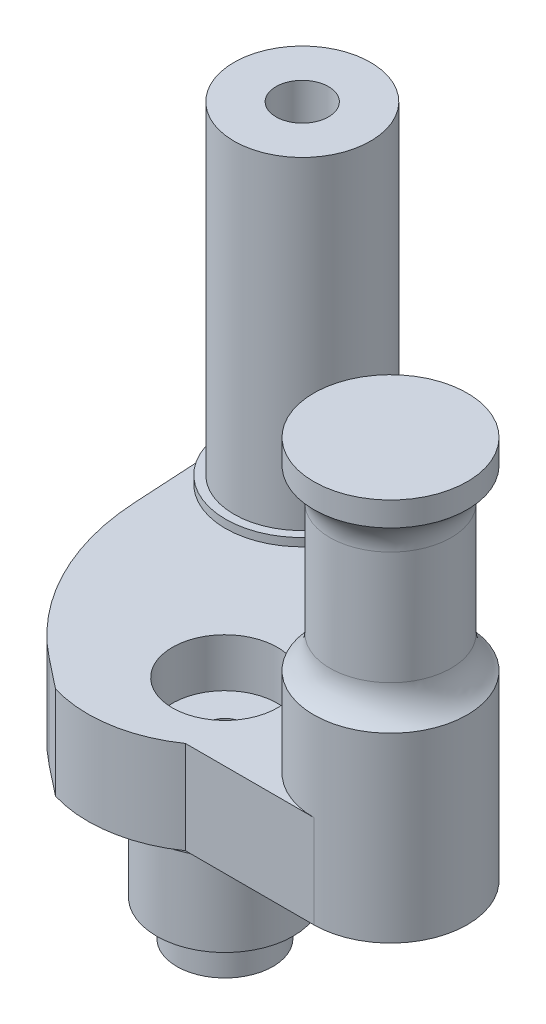
ISO-10303-21;
HEADER;
FILE_DESCRIPTION(('STEP AP214'),'2;1');
FILE_NAME('part.step','',(''),(''),'','','');
FILE_SCHEMA(('AUTOMOTIVE_DESIGN { 1 0 10303 214 1 1 1 1 }'));
ENDSEC;
DATA;
#1=APPLICATION_CONTEXT('core data for automotive mechanical design processes');
#2=APPLICATION_PROTOCOL_DEFINITION('international standard','automotive_design',2000,#1);
#3=PRODUCT_CONTEXT('',#1,'mechanical');
#4=PRODUCT('Part','Part','',(#3));
#5=PRODUCT_RELATED_PRODUCT_CATEGORY('part','',(#4));
#6=PRODUCT_DEFINITION_FORMATION('','',#4);
#7=PRODUCT_DEFINITION_CONTEXT('part definition',#1,'design');
#8=PRODUCT_DEFINITION('design','',#6,#7);
#9=PRODUCT_DEFINITION_SHAPE('','',#8);
#10=(LENGTH_UNIT() NAMED_UNIT(*) SI_UNIT(.MILLI.,.METRE.));
#11=(NAMED_UNIT(*) PLANE_ANGLE_UNIT() SI_UNIT($,.RADIAN.));
#12=(NAMED_UNIT(*) SI_UNIT($,.STERADIAN.) SOLID_ANGLE_UNIT());
#13=UNCERTAINTY_MEASURE_WITH_UNIT(LENGTH_MEASURE(1.E-05),#10,'distance_accuracy_value','');
#14=(GEOMETRIC_REPRESENTATION_CONTEXT(3) GLOBAL_UNCERTAINTY_ASSIGNED_CONTEXT((#13)) GLOBAL_UNIT_ASSIGNED_CONTEXT((#10,
#11,#12)) REPRESENTATION_CONTEXT('',''));
#15=CARTESIAN_POINT('',(0.,0.,0.));
#16=DIRECTION('',(0.,0.,1.));
#17=DIRECTION('',(1.,0.,0.));
#18=AXIS2_PLACEMENT_3D('',#15,#16,#17);
#19=CARTESIAN_POINT('',(20.5,64.,0.));
#20=DIRECTION('',(0.,-1.,0.));
#21=DIRECTION('',(0.,0.,-1.));
#22=AXIS2_PLACEMENT_3D('',#19,#20,#21);
#23=CYLINDRICAL_SURFACE('',#22,9.5);
#24=CARTESIAN_POINT('',(20.5,16.5,0.));
#25=DIRECTION('',(0.,1.,0.));
#26=DIRECTION('',(0.,0.,1.));
#27=AXIS2_PLACEMENT_3D('',#24,#25,#26);
#28=CIRCLE('',#27,9.5);
#29=CARTESIAN_POINT('',(20.5,16.5,-9.5));
#30=VERTEX_POINT('',#29);
#31=CARTESIAN_POINT('',(20.5,16.5,9.5));
#32=VERTEX_POINT('',#31);
#33=EDGE_CURVE('E168',#30,#32,#28,.F.);
#34=ORIENTED_EDGE('',*,*,#33,.F.);
#35=DIRECTION('',(0.,1.,0.));
#36=VECTOR('',#35,1.);
#37=CARTESIAN_POINT('',(20.5,9.99999999999999,-9.5));
#38=LINE('',#37,#36);
#39=CARTESIAN_POINT('',(20.5,28.,-9.5));
#40=VERTEX_POINT('',#39);
#41=EDGE_CURVE('E171',#30,#40,#38,.T.);
#42=ORIENTED_EDGE('',*,*,#41,.T.);
#43=CARTESIAN_POINT('',(20.5,28.,0.));
#44=DIRECTION('',(0.,1.,0.));
#45=DIRECTION('',(0.,0.,1.));
#46=AXIS2_PLACEMENT_3D('',#43,#44,#45);
#47=CIRCLE('',#46,9.5);
#48=CARTESIAN_POINT('',(20.5,28.,9.5));
#49=VERTEX_POINT('',#48);
#50=EDGE_CURVE('E201',#49,#40,#47,.F.);
#51=ORIENTED_EDGE('',*,*,#50,.F.);
#52=DIRECTION('',(0.,1.,0.));
#53=VECTOR('',#52,1.);
#54=CARTESIAN_POINT('',(20.5,9.99999999999999,9.5));
#55=LINE('',#54,#53);
#56=EDGE_CURVE('E174',#32,#49,#55,.T.);
#57=ORIENTED_EDGE('',*,*,#56,.F.);
#58=EDGE_LOOP('',(#34,#42,#51,#57));
#59=FACE_BOUND('',#58,.T.);
#60=CARTESIAN_POINT('',(20.5,39.,0.));
#61=DIRECTION('',(0.,1.,0.));
#62=DIRECTION('',(0.,0.,1.));
#63=AXIS2_PLACEMENT_3D('',#60,#61,#62);
#64=CIRCLE('',#63,9.5);
#65=CARTESIAN_POINT('',(20.5,39.,9.5));
#66=VERTEX_POINT('',#65);
#67=EDGE_CURVE('E164',#66,#66,#64,.T.);
#68=ORIENTED_EDGE('',*,*,#67,.F.);
#69=EDGE_LOOP('',(#68));
#70=FACE_BOUND('',#69,.T.);
#71=ADVANCED_FACE('F33',(#59,#70),#23,.T.);
#72=CARTESIAN_POINT('',(-0.833655922108794,28.,-0.499999999999999));
#73=DIRECTION('',(0.,1.,0.));
#74=DIRECTION('',(0.,0.,1.));
#75=AXIS2_PLACEMENT_3D('',#72,#73,#74);
#76=PLANE('',#75);
#77=DIRECTION('',(-1.,0.,0.));
#78=VECTOR('',#77,1.);
#79=CARTESIAN_POINT('',(7.00207538209712,28.,-9.5));
#80=LINE('',#79,#78);
#81=CARTESIAN_POINT('',(10.4713346025976,28.,-9.5));
#82=VERTEX_POINT('',#81);
#83=EDGE_CURVE('E124',#40,#82,#80,.T.);
#84=ORIENTED_EDGE('',*,*,#83,.T.);
#85=CARTESIAN_POINT('',(-4.59066256217014,28.,-3.73892504377688));
#86=DIRECTION('',(0.,1.,0.));
#87=DIRECTION('',(0.,0.,1.));
#88=AXIS2_PLACEMENT_3D('',#85,#86,#87);
#89=CIRCLE('',#88,16.1261819176981);
#90=CARTESIAN_POINT('',(9.37187276386313,28.,-11.8074658357643));
#91=VERTEX_POINT('',#90);
#92=EDGE_CURVE('E118',#82,#91,#89,.T.);
#93=ORIENTED_EDGE('',*,*,#92,.T.);
#94=DIRECTION('',(-0.784978393682853,0.,-0.619523140367724));
#95=VECTOR('',#94,1.);
#96=CARTESIAN_POINT('',(9.37187276386313,28.,-11.8074658357643));
#97=LINE('',#96,#95);
#98=CARTESIAN_POINT('',(-4.95541630779931,28.,-23.1148944096756));
#99=VERTEX_POINT('',#98);
#100=EDGE_CURVE('E123',#91,#99,#97,.T.);
#101=ORIENTED_EDGE('',*,*,#100,.T.);
#102=DIRECTION('',(-0.342020143325673,0.,-0.939692620785907));
#103=VECTOR('',#102,1.);
#104=CARTESIAN_POINT('',(-2.39485082576202,28.,-16.0797985667433));
#105=LINE('',#104,#103);
#106=CARTESIAN_POINT('',(-7.01141293817628,28.,-28.7636987261111));
#107=VERTEX_POINT('',#106);
#108=EDGE_CURVE('E48',#99,#107,#105,.T.);
#109=ORIENTED_EDGE('',*,*,#108,.T.);
#110=CARTESIAN_POINT('',(-15.9384928356424,28.,-25.5145073645172));
#111=DIRECTION('',(0.,1.,0.));
#112=DIRECTION('',(0.,0.,1.));
#113=AXIS2_PLACEMENT_3D('',#110,#111,#112);
#114=CIRCLE('',#113,9.50000000000001);
#115=CARTESIAN_POINT('',(-24.8655727331085,28.,-22.2653160029233));
#116=VERTEX_POINT('',#115);
#117=EDGE_CURVE('E218',#116,#107,#114,.T.);
#118=ORIENTED_EDGE('',*,*,#117,.F.);
#119=DIRECTION('',(0.0572306718588479,0.,0.998360981909141));
#120=VECTOR('',#119,1.);
#121=CARTESIAN_POINT('',(-24.3377118734043,28.,-13.0570423781535));
#122=LINE('',#121,#120);
#123=CARTESIAN_POINT('',(-24.3377118734043,28.,-13.0570423781535));
#124=VERTEX_POINT('',#123);
#125=EDGE_CURVE('E141',#116,#124,#122,.T.);
#126=ORIENTED_EDGE('',*,*,#125,.T.);
#127=CARTESIAN_POINT('',(5.61311758386992,28.,-14.7739625339188));
#128=DIRECTION('',(0.,1.,0.));
#129=DIRECTION('',(0.,0.,-1.));
#130=AXIS2_PLACEMENT_3D('',#127,#128,#129);
#131=CIRCLE('',#130,30.);
#132=CARTESIAN_POINT('',(-12.9725766271618,28.,8.77538927656681));
#133=VERTEX_POINT('',#132);
#134=EDGE_CURVE('E144',#124,#133,#131,.T.);
#135=ORIENTED_EDGE('',*,*,#134,.T.);
#136=DIRECTION('',(0.784978393682853,0.,0.619523140367725));
#137=VECTOR('',#136,1.);
#138=CARTESIAN_POINT('',(-9.27848203552042,28.,11.6908543398686));
#139=LINE('',#138,#137);
#140=CARTESIAN_POINT('',(-9.27848203552042,28.,11.6908543398686));
#141=VERTEX_POINT('',#140);
#142=EDGE_CURVE('E137',#133,#141,#139,.T.);
#143=ORIENTED_EDGE('',*,*,#142,.T.);
#144=CARTESIAN_POINT('',(4.61719315607121,28.,9.5));
#145=VERTEX_POINT('',#144);
#146=EDGE_CURVE('E126',#141,#145,#89,.T.);
#147=ORIENTED_EDGE('',*,*,#146,.T.);
#148=DIRECTION('',(1.,0.,0.));
#149=VECTOR('',#148,1.);
#150=CARTESIAN_POINT('',(30.,28.,9.5));
#151=LINE('',#150,#149);
#152=EDGE_CURVE('E217',#145,#49,#151,.T.);
#153=ORIENTED_EDGE('',*,*,#152,.T.);
#154=ORIENTED_EDGE('',*,*,#50,.T.);
#155=EDGE_LOOP('',(#84,#93,#101,#109,#118,#126,#135,#143,#147,#153,#154));
#156=FACE_BOUND('',#155,.T.);
#157=CARTESIAN_POINT('',(0.,28.,0.));
#158=DIRECTION('',(0.,1.,0.));
#159=DIRECTION('',(0.,0.,1.));
#160=AXIS2_PLACEMENT_3D('',#157,#158,#159);
#161=CIRCLE('',#160,6.5);
#162=CARTESIAN_POINT('',(0.,28.,6.5));
#163=VERTEX_POINT('',#162);
#164=EDGE_CURVE('E204',#163,#163,#161,.T.);
#165=ORIENTED_EDGE('',*,*,#164,.F.);
#166=EDGE_LOOP('',(#165));
#167=FACE_BOUND('',#166,.T.);
#168=ADVANCED_FACE('F120',(#156,#167),#76,.T.);
#169=CARTESIAN_POINT('',(0.,29.,0.));
#170=DIRECTION('',(0.,-1.,0.));
#171=DIRECTION('',(0.,0.,-1.));
#172=AXIS2_PLACEMENT_3D('',#169,#170,#171);
#173=CYLINDRICAL_SURFACE('',#172,2.3);
#174=CARTESIAN_POINT('',(0.,0.,0.));
#175=DIRECTION('',(0.,-1.,0.));
#176=DIRECTION('',(0.,0.,-1.));
#177=AXIS2_PLACEMENT_3D('',#174,#175,#176);
#178=CIRCLE('',#177,2.3);
#179=CARTESIAN_POINT('',(0.,0.,-2.3));
#180=VERTEX_POINT('',#179);
#181=EDGE_CURVE('E211',#180,#180,#178,.T.);
#182=ORIENTED_EDGE('',*,*,#181,.T.);
#183=EDGE_LOOP('',(#182));
#184=FACE_BOUND('',#183,.T.);
#185=CARTESIAN_POINT('',(0.,22.,0.));
#186=DIRECTION('',(0.,1.,0.));
#187=DIRECTION('',(0.,0.,1.));
#188=AXIS2_PLACEMENT_3D('',#185,#186,#187);
#189=CIRCLE('',#188,2.3);
#190=CARTESIAN_POINT('',(0.,22.,2.3));
#191=VERTEX_POINT('',#190);
#192=EDGE_CURVE('E208',#191,#191,#189,.F.);
#193=ORIENTED_EDGE('',*,*,#192,.F.);
#194=EDGE_LOOP('',(#193));
#195=FACE_BOUND('',#194,.T.);
#196=ADVANCED_FACE('F280',(#184,#195),#173,.F.);
#197=CARTESIAN_POINT('',(0.,22.25,0.));
#198=DIRECTION('',(0.,-1.,0.));
#199=DIRECTION('',(0.,0.,-1.));
#200=AXIS2_PLACEMENT_3D('',#197,#198,#199);
#201=CYLINDRICAL_SURFACE('',#200,8.45);
#202=CARTESIAN_POINT('',(0.,15.5,0.));
#203=DIRECTION('',(0.,-1.,0.));
#204=DIRECTION('',(0.,0.,-1.));
#205=AXIS2_PLACEMENT_3D('',#202,#203,#204);
#206=CIRCLE('',#205,8.45);
#207=CARTESIAN_POINT('',(0.,15.5,-8.45));
#208=VERTEX_POINT('',#207);
#209=EDGE_CURVE('E190',#208,#208,#206,.T.);
#210=ORIENTED_EDGE('',*,*,#209,.T.);
#211=EDGE_LOOP('',(#210));
#212=FACE_BOUND('',#211,.T.);
#213=CARTESIAN_POINT('',(0.,4.5,0.));
#214=DIRECTION('',(0.,1.,0.));
#215=DIRECTION('',(0.,0.,1.));
#216=AXIS2_PLACEMENT_3D('',#213,#214,#215);
#217=CIRCLE('',#216,8.45);
#218=CARTESIAN_POINT('',(0.,4.5,8.45));
#219=VERTEX_POINT('',#218);
#220=EDGE_CURVE('E230',#219,#219,#217,.T.);
#221=ORIENTED_EDGE('',*,*,#220,.T.);
#222=EDGE_LOOP('',(#221));
#223=FACE_BOUND('',#222,.T.);
#224=ADVANCED_FACE('F296',(#212,#223),#201,.T.);
#225=CARTESIAN_POINT('',(0.,4.5,0.));
#226=DIRECTION('',(0.,-1.,0.));
#227=DIRECTION('',(0.,0.,-1.));
#228=AXIS2_PLACEMENT_3D('',#225,#226,#227);
#229=CYLINDRICAL_SURFACE('',#228,5.95);
#230=CARTESIAN_POINT('',(0.,4.5,0.));
#231=DIRECTION('',(0.,1.,0.));
#232=DIRECTION('',(0.,0.,1.));
#233=AXIS2_PLACEMENT_3D('',#230,#231,#232);
#234=CIRCLE('',#233,5.95);
#235=CARTESIAN_POINT('',(0.,4.5,5.95));
#236=VERTEX_POINT('',#235);
#237=EDGE_CURVE('E220',#236,#236,#234,.T.);
#238=ORIENTED_EDGE('',*,*,#237,.F.);
#239=EDGE_LOOP('',(#238));
#240=FACE_BOUND('',#239,.T.);
#241=CARTESIAN_POINT('',(0.,0.,0.));
#242=DIRECTION('',(0.,1.,0.));
#243=DIRECTION('',(0.,0.,1.));
#244=AXIS2_PLACEMENT_3D('',#241,#242,#243);
#245=CIRCLE('',#244,5.95);
#246=CARTESIAN_POINT('',(0.,0.,5.95));
#247=VERTEX_POINT('',#246);
#248=EDGE_CURVE('E233',#247,#247,#245,.T.);
#249=ORIENTED_EDGE('',*,*,#248,.T.);
#250=EDGE_LOOP('',(#249));
#251=FACE_BOUND('',#250,.T.);
#252=ADVANCED_FACE('F326',(#240,#251),#229,.T.);
#253=CARTESIAN_POINT('',(0.,0.,0.));
#254=DIRECTION('',(0.,1.,0.));
#255=DIRECTION('',(0.,0.,1.));
#256=AXIS2_PLACEMENT_3D('',#253,#254,#255);
#257=PLANE('',#256);
#258=ORIENTED_EDGE('',*,*,#181,.F.);
#259=EDGE_LOOP('',(#258));
#260=FACE_BOUND('',#259,.T.);
#261=ORIENTED_EDGE('',*,*,#248,.F.);
#262=EDGE_LOOP('',(#261));
#263=FACE_BOUND('',#262,.T.);
#264=ADVANCED_FACE('F322',(#260,#263),#257,.F.);
#265=CARTESIAN_POINT('',(0.,4.5,0.));
#266=DIRECTION('',(0.,1.,0.));
#267=DIRECTION('',(0.,0.,1.));
#268=AXIS2_PLACEMENT_3D('',#265,#266,#267);
#269=PLANE('',#268);
#270=ORIENTED_EDGE('',*,*,#237,.T.);
#271=EDGE_LOOP('',(#270));
#272=FACE_BOUND('',#271,.T.);
#273=ORIENTED_EDGE('',*,*,#220,.F.);
#274=EDGE_LOOP('',(#273));
#275=FACE_BOUND('',#274,.T.);
#276=ADVANCED_FACE('F314',(#272,#275),#269,.F.);
#277=CARTESIAN_POINT('',(0.,16.5,9.5));
#278=DIRECTION('',(0.,0.,1.));
#279=DIRECTION('',(1.,0.,0.));
#280=AXIS2_PLACEMENT_3D('',#277,#278,#279);
#281=PLANE('',#280);
#282=DIRECTION('',(0.,1.,0.));
#283=VECTOR('',#282,1.);
#284=CARTESIAN_POINT('',(4.61719315607121,-34.6003432232158,9.5));
#285=LINE('',#284,#283);
#286=CARTESIAN_POINT('',(4.61719315607121,16.5,9.5));
#287=VERTEX_POINT('',#286);
#288=EDGE_CURVE('E160',#287,#145,#285,.T.);
#289=ORIENTED_EDGE('',*,*,#288,.F.);
#290=DIRECTION('',(1.,0.,0.));
#291=VECTOR('',#290,1.);
#292=CARTESIAN_POINT('',(30.,16.5,9.5));
#293=LINE('',#292,#291);
#294=EDGE_CURVE('E224',#287,#32,#293,.T.);
#295=ORIENTED_EDGE('',*,*,#294,.T.);
#296=ORIENTED_EDGE('',*,*,#56,.T.);
#297=ORIENTED_EDGE('',*,*,#152,.F.);
#298=EDGE_LOOP('',(#289,#295,#296,#297));
#299=FACE_BOUND('',#298,.T.);
#300=ADVANCED_FACE('F310',(#299),#281,.T.);
#301=CARTESIAN_POINT('',(-2.39485082576202,16.5,-16.0797985667433));
#302=DIRECTION('',(0.939692620785907,0.,-0.342020143325673));
#303=DIRECTION('',(-0.342020143325673,0.,-0.939692620785907));
#304=AXIS2_PLACEMENT_3D('',#301,#302,#303);
#305=PLANE('',#304);
#306=DIRECTION('',(0.,1.,0.));
#307=VECTOR('',#306,1.);
#308=CARTESIAN_POINT('',(-4.95541630779932,16.5,-23.1148944096757));
#309=LINE('',#308,#307);
#310=CARTESIAN_POINT('',(-4.95541630779932,16.5,-23.1148944096757));
#311=VERTEX_POINT('',#310);
#312=EDGE_CURVE('E140',#311,#99,#309,.T.);
#313=ORIENTED_EDGE('',*,*,#312,.F.);
#314=DIRECTION('',(-0.342020143325673,0.,-0.939692620785907));
#315=VECTOR('',#314,1.);
#316=CARTESIAN_POINT('',(-2.39485082576202,16.5,-16.0797985667433));
#317=LINE('',#316,#315);
#318=CARTESIAN_POINT('',(-7.01141293817628,16.5,-28.7636987261111));
#319=VERTEX_POINT('',#318);
#320=EDGE_CURVE('E228',#311,#319,#317,.T.);
#321=ORIENTED_EDGE('',*,*,#320,.T.);
#322=DIRECTION('',(0.,1.,0.));
#323=VECTOR('',#322,1.);
#324=CARTESIAN_POINT('',(-7.01141293817628,9.99999999999999,-28.7636987261111));
#325=LINE('',#324,#323);
#326=EDGE_CURVE('E169',#319,#107,#325,.T.);
#327=ORIENTED_EDGE('',*,*,#326,.T.);
#328=ORIENTED_EDGE('',*,*,#108,.F.);
#329=EDGE_LOOP('',(#313,#321,#327,#328));
#330=FACE_BOUND('',#329,.T.);
#331=ADVANCED_FACE('F313',(#330),#305,.T.);
#332=CARTESIAN_POINT('',(7.00207538209712,16.5,-9.5));
#333=DIRECTION('',(0.,0.,-1.));
#334=DIRECTION('',(-1.,0.,0.));
#335=AXIS2_PLACEMENT_3D('',#332,#333,#334);
#336=PLANE('',#335);
#337=DIRECTION('',(0.,1.,0.));
#338=VECTOR('',#337,1.);
#339=CARTESIAN_POINT('',(10.4713346025976,-34.6003432232158,-9.5));
#340=LINE('',#339,#338);
#341=CARTESIAN_POINT('',(10.4713346025976,16.5,-9.5));
#342=VERTEX_POINT('',#341);
#343=EDGE_CURVE('E56',#82,#342,#340,.F.);
#344=ORIENTED_EDGE('',*,*,#343,.F.);
#345=ORIENTED_EDGE('',*,*,#83,.F.);
#346=ORIENTED_EDGE('',*,*,#41,.F.);
#347=DIRECTION('',(-1.,0.,0.));
#348=VECTOR('',#347,1.);
#349=CARTESIAN_POINT('',(7.00207538209712,16.5,-9.5));
#350=LINE('',#349,#348);
#351=EDGE_CURVE('E226',#30,#342,#350,.T.);
#352=ORIENTED_EDGE('',*,*,#351,.T.);
#353=EDGE_LOOP('',(#344,#345,#346,#352));
#354=FACE_BOUND('',#353,.T.);
#355=ADVANCED_FACE('F308',(#354),#336,.T.);
#356=CARTESIAN_POINT('',(-0.833655922108794,16.5,-0.499999999999999));
#357=DIRECTION('',(0.,1.,0.));
#358=DIRECTION('',(0.,0.,1.));
#359=AXIS2_PLACEMENT_3D('',#356,#357,#358);
#360=PLANE('',#359);
#361=ORIENTED_EDGE('',*,*,#294,.F.);
#362=CARTESIAN_POINT('',(-4.59066256217014,16.5,-3.73892504377688));
#363=DIRECTION('',(0.,1.,0.));
#364=DIRECTION('',(0.,0.,1.));
#365=AXIS2_PLACEMENT_3D('',#362,#363,#364);
#366=CIRCLE('',#365,16.1261819176981);
#367=CARTESIAN_POINT('',(-9.27848203552042,16.5,11.6908543398686));
#368=VERTEX_POINT('',#367);
#369=EDGE_CURVE('E603',#287,#368,#366,.F.);
#370=ORIENTED_EDGE('',*,*,#369,.T.);
#371=DIRECTION('',(-0.784978393682853,0.,-0.619523140367725));
#372=VECTOR('',#371,1.);
#373=CARTESIAN_POINT('',(-9.27848203552042,16.5,11.6908543398686));
#374=LINE('',#373,#372);
#375=CARTESIAN_POINT('',(-12.9725766271618,16.5,8.77538927656682));
#376=VERTEX_POINT('',#375);
#377=EDGE_CURVE('E608',#368,#376,#374,.T.);
#378=ORIENTED_EDGE('',*,*,#377,.T.);
#379=CARTESIAN_POINT('',(5.61311758386992,16.5,-14.7739625339188));
#380=DIRECTION('',(0.,1.,0.));
#381=DIRECTION('',(0.,0.,1.));
#382=AXIS2_PLACEMENT_3D('',#379,#380,#381);
#383=CIRCLE('',#382,30.);
#384=CARTESIAN_POINT('',(-24.3377118734043,16.5,-13.0570423781535));
#385=VERTEX_POINT('',#384);
#386=EDGE_CURVE('E618',#376,#385,#383,.F.);
#387=ORIENTED_EDGE('',*,*,#386,.T.);
#388=DIRECTION('',(-0.0572306718588479,0.,-0.998360981909141));
#389=VECTOR('',#388,1.);
#390=CARTESIAN_POINT('',(-24.3377118734043,16.5,-13.0570423781535));
#391=LINE('',#390,#389);
#392=CARTESIAN_POINT('',(-24.8655727331085,16.5,-22.2653160029233));
#393=VERTEX_POINT('',#392);
#394=EDGE_CURVE('E155',#385,#393,#391,.T.);
#395=ORIENTED_EDGE('',*,*,#394,.T.);
#396=CARTESIAN_POINT('',(-15.9384928356424,16.5,-25.5145073645172));
#397=DIRECTION('',(0.,1.,0.));
#398=DIRECTION('',(0.,0.,1.));
#399=AXIS2_PLACEMENT_3D('',#396,#397,#398);
#400=CIRCLE('',#399,9.50000000000001);
#401=EDGE_CURVE('E200',#393,#319,#400,.F.);
#402=ORIENTED_EDGE('',*,*,#401,.T.);
#403=ORIENTED_EDGE('',*,*,#320,.F.);
#404=DIRECTION('',(0.784978393682854,0.,0.619523140367724));
#405=VECTOR('',#404,1.);
#406=CARTESIAN_POINT('',(9.37187276386313,16.5,-11.8074658357643));
#407=LINE('',#406,#405);
#408=CARTESIAN_POINT('',(9.37187276386313,16.5,-11.8074658357643));
#409=VERTEX_POINT('',#408);
#410=EDGE_CURVE('E161',#311,#409,#407,.T.);
#411=ORIENTED_EDGE('',*,*,#410,.T.);
#412=EDGE_CURVE('E133',#409,#342,#366,.F.);
#413=ORIENTED_EDGE('',*,*,#412,.T.);
#414=ORIENTED_EDGE('',*,*,#351,.F.);
#415=ORIENTED_EDGE('',*,*,#33,.T.);
#416=EDGE_LOOP('',(#361,#370,#378,#387,#395,#402,#403,#411,#413,#414,#415));
#417=FACE_BOUND('',#416,.T.);
#418=CARTESIAN_POINT('',(0.,16.5,0.));
#419=DIRECTION('',(0.,-1.,0.));
#420=DIRECTION('',(0.,0.,-1.));
#421=AXIS2_PLACEMENT_3D('',#418,#419,#420);
#422=CIRCLE('',#421,9.5);
#423=CARTESIAN_POINT('',(0.,16.5,-9.5));
#424=VERTEX_POINT('',#423);
#425=EDGE_CURVE('E184',#424,#424,#422,.T.);
#426=ORIENTED_EDGE('',*,*,#425,.F.);
#427=EDGE_LOOP('',(#426));
#428=FACE_BOUND('',#427,.T.);
#429=ADVANCED_FACE('F303',(#417,#428),#360,.F.);
#430=CARTESIAN_POINT('',(-15.9384928356424,29.,-25.5145073645172));
#431=DIRECTION('',(0.,-1.,0.));
#432=DIRECTION('',(0.,0.,-1.));
#433=AXIS2_PLACEMENT_3D('',#430,#431,#432);
#434=CYLINDRICAL_SURFACE('',#433,9.50000000000001);
#435=ORIENTED_EDGE('',*,*,#401,.F.);
#436=DIRECTION('',(0.,1.,0.));
#437=VECTOR('',#436,1.);
#438=CARTESIAN_POINT('',(-24.8655727331085,9.99999999999999,-22.2653160029233));
#439=LINE('',#438,#437);
#440=EDGE_CURVE('E165',#393,#116,#439,.T.);
#441=ORIENTED_EDGE('',*,*,#440,.T.);
#442=ORIENTED_EDGE('',*,*,#117,.T.);
#443=ORIENTED_EDGE('',*,*,#326,.F.);
#444=EDGE_LOOP('',(#435,#441,#442,#443));
#445=FACE_BOUND('',#444,.T.);
#446=CARTESIAN_POINT('',(-15.9384928356424,29.,-25.5145073645172));
#447=DIRECTION('',(0.,1.,0.));
#448=DIRECTION('',(0.,0.,1.));
#449=AXIS2_PLACEMENT_3D('',#446,#447,#448);
#450=CIRCLE('',#449,9.50000000000001);
#451=CARTESIAN_POINT('',(-15.9384928356424,29.,-16.0145073645172));
#452=VERTEX_POINT('',#451);
#453=EDGE_CURVE('E214',#452,#452,#450,.T.);
#454=ORIENTED_EDGE('',*,*,#453,.F.);
#455=EDGE_LOOP('',(#454));
#456=FACE_BOUND('',#455,.T.);
#457=ADVANCED_FACE('F300',(#445,#456),#434,.T.);
#458=CARTESIAN_POINT('',(-15.9384928356424,29.,-25.5145073645172));
#459=DIRECTION('',(0.,1.,0.));
#460=DIRECTION('',(0.,0.,1.));
#461=AXIS2_PLACEMENT_3D('',#458,#459,#460);
#462=PLANE('',#461);
#463=CARTESIAN_POINT('',(-15.9384928356424,29.,-25.5145073645172));
#464=DIRECTION('',(0.,1.,0.));
#465=DIRECTION('',(0.,0.,1.));
#466=AXIS2_PLACEMENT_3D('',#463,#464,#465);
#467=CIRCLE('',#466,8.45);
#468=CARTESIAN_POINT('',(-15.9384928356424,29.,-17.0645073645172));
#469=VERTEX_POINT('',#468);
#470=EDGE_CURVE('E197',#469,#469,#467,.T.);
#471=ORIENTED_EDGE('',*,*,#470,.F.);
#472=EDGE_LOOP('',(#471));
#473=FACE_BOUND('',#472,.T.);
#474=ORIENTED_EDGE('',*,*,#453,.T.);
#475=EDGE_LOOP('',(#474));
#476=FACE_BOUND('',#475,.T.);
#477=ADVANCED_FACE('F288',(#473,#476),#462,.T.);
#478=CARTESIAN_POINT('',(0.,22.,0.));
#479=DIRECTION('',(0.,1.,0.));
#480=DIRECTION('',(0.,0.,1.));
#481=AXIS2_PLACEMENT_3D('',#478,#479,#480);
#482=PLANE('',#481);
#483=CARTESIAN_POINT('',(0.,22.,0.));
#484=DIRECTION('',(0.,1.,0.));
#485=DIRECTION('',(0.,0.,1.));
#486=AXIS2_PLACEMENT_3D('',#483,#484,#485);
#487=CIRCLE('',#486,6.5);
#488=CARTESIAN_POINT('',(0.,22.,6.5));
#489=VERTEX_POINT('',#488);
#490=EDGE_CURVE('E205',#489,#489,#487,.T.);
#491=ORIENTED_EDGE('',*,*,#490,.T.);
#492=EDGE_LOOP('',(#491));
#493=FACE_BOUND('',#492,.T.);
#494=ORIENTED_EDGE('',*,*,#192,.T.);
#495=EDGE_LOOP('',(#494));
#496=FACE_BOUND('',#495,.T.);
#497=ADVANCED_FACE('F284',(#493,#496),#482,.T.);
#498=CARTESIAN_POINT('',(0.,22.,0.));
#499=DIRECTION('',(0.,1.,0.));
#500=DIRECTION('',(0.,0.,1.));
#501=AXIS2_PLACEMENT_3D('',#498,#499,#500);
#502=CYLINDRICAL_SURFACE('',#501,6.5);
#503=ORIENTED_EDGE('',*,*,#490,.F.);
#504=EDGE_LOOP('',(#503));
#505=FACE_BOUND('',#504,.T.);
#506=ORIENTED_EDGE('',*,*,#164,.T.);
#507=EDGE_LOOP('',(#506));
#508=FACE_BOUND('',#507,.T.);
#509=ADVANCED_FACE('F287',(#505,#508),#502,.F.);
#510=CARTESIAN_POINT('',(-15.9384928356424,69.,-25.5145073645172));
#511=DIRECTION('',(0.,-1.,0.));
#512=DIRECTION('',(0.,0.,-1.));
#513=AXIS2_PLACEMENT_3D('',#510,#511,#512);
#514=CYLINDRICAL_SURFACE('',#513,8.45);
#515=CARTESIAN_POINT('',(-15.9384928356424,69.,-25.5145073645172));
#516=DIRECTION('',(0.,1.,0.));
#517=DIRECTION('',(0.,0.,1.));
#518=AXIS2_PLACEMENT_3D('',#515,#516,#517);
#519=CIRCLE('',#518,8.45);
#520=CARTESIAN_POINT('',(-15.9384928356424,69.,-17.0645073645172));
#521=VERTEX_POINT('',#520);
#522=EDGE_CURVE('E193',#521,#521,#519,.T.);
#523=ORIENTED_EDGE('',*,*,#522,.F.);
#524=EDGE_LOOP('',(#523));
#525=FACE_BOUND('',#524,.T.);
#526=ORIENTED_EDGE('',*,*,#470,.T.);
#527=EDGE_LOOP('',(#526));
#528=FACE_BOUND('',#527,.T.);
#529=ADVANCED_FACE('F292',(#525,#528),#514,.T.);
#530=CARTESIAN_POINT('',(-15.9384928356424,69.,-25.5145073645172));
#531=DIRECTION('',(0.,1.,0.));
#532=DIRECTION('',(0.,0.,1.));
#533=AXIS2_PLACEMENT_3D('',#530,#531,#532);
#534=PLANE('',#533);
#535=CARTESIAN_POINT('',(-15.9384928356424,69.,-25.5145073645172));
#536=DIRECTION('',(0.,1.,0.));
#537=DIRECTION('',(0.,0.,1.));
#538=AXIS2_PLACEMENT_3D('',#535,#536,#537);
#539=CIRCLE('',#538,3.25);
#540=CARTESIAN_POINT('',(-15.9384928356424,69.,-22.2645073645172));
#541=VERTEX_POINT('',#540);
#542=EDGE_CURVE('E180',#541,#541,#539,.T.);
#543=ORIENTED_EDGE('',*,*,#542,.F.);
#544=EDGE_LOOP('',(#543));
#545=FACE_BOUND('',#544,.T.);
#546=ORIENTED_EDGE('',*,*,#522,.T.);
#547=EDGE_LOOP('',(#546));
#548=FACE_BOUND('',#547,.T.);
#549=ADVANCED_FACE('F489',(#545,#548),#534,.T.);
#550=CARTESIAN_POINT('',(0.,15.5,0.));
#551=DIRECTION('',(0.,-1.,0.));
#552=DIRECTION('',(0.,0.,-1.));
#553=AXIS2_PLACEMENT_3D('',#550,#551,#552);
#554=PLANE('',#553);
#555=ORIENTED_EDGE('',*,*,#209,.F.);
#556=EDGE_LOOP('',(#555));
#557=FACE_BOUND('',#556,.T.);
#558=CARTESIAN_POINT('',(0.,15.5,0.));
#559=DIRECTION('',(0.,-1.,0.));
#560=DIRECTION('',(0.,0.,-1.));
#561=AXIS2_PLACEMENT_3D('',#558,#559,#560);
#562=CIRCLE('',#561,9.5);
#563=CARTESIAN_POINT('',(0.,15.5,-9.5));
#564=VERTEX_POINT('',#563);
#565=EDGE_CURVE('E187',#564,#564,#562,.T.);
#566=ORIENTED_EDGE('',*,*,#565,.T.);
#567=EDGE_LOOP('',(#566));
#568=FACE_BOUND('',#567,.T.);
#569=ADVANCED_FACE('F480',(#557,#568),#554,.T.);
#570=CARTESIAN_POINT('',(0.,15.5,0.));
#571=DIRECTION('',(0.,1.,0.));
#572=DIRECTION('',(0.,0.,1.));
#573=AXIS2_PLACEMENT_3D('',#570,#571,#572);
#574=CYLINDRICAL_SURFACE('',#573,9.5);
#575=ORIENTED_EDGE('',*,*,#565,.F.);
#576=EDGE_LOOP('',(#575));
#577=FACE_BOUND('',#576,.T.);
#578=ORIENTED_EDGE('',*,*,#425,.T.);
#579=EDGE_LOOP('',(#578));
#580=FACE_BOUND('',#579,.T.);
#581=ADVANCED_FACE('F471',(#577,#580),#574,.T.);
#582=CARTESIAN_POINT('',(-15.9384928356424,61.,-25.5145073645172));
#583=DIRECTION('',(0.,1.,0.));
#584=DIRECTION('',(0.,0.,1.));
#585=AXIS2_PLACEMENT_3D('',#582,#583,#584);
#586=CYLINDRICAL_SURFACE('',#585,3.25);
#587=CARTESIAN_POINT('',(-15.9384928356424,61.,-25.5145073645172));
#588=DIRECTION('',(0.,1.,0.));
#589=DIRECTION('',(0.,0.,1.));
#590=AXIS2_PLACEMENT_3D('',#587,#588,#589);
#591=CIRCLE('',#590,3.25);
#592=CARTESIAN_POINT('',(-15.9384928356424,61.,-22.2645073645172));
#593=VERTEX_POINT('',#592);
#594=EDGE_CURVE('E181',#593,#593,#591,.T.);
#595=ORIENTED_EDGE('',*,*,#594,.F.);
#596=EDGE_LOOP('',(#595));
#597=FACE_BOUND('',#596,.T.);
#598=ORIENTED_EDGE('',*,*,#542,.T.);
#599=EDGE_LOOP('',(#598));
#600=FACE_BOUND('',#599,.T.);
#601=ADVANCED_FACE('F462',(#597,#600),#586,.F.);
#602=CARTESIAN_POINT('',(-15.9384928356424,61.,-25.5145073645172));
#603=DIRECTION('',(0.,1.,0.));
#604=DIRECTION('',(0.,0.,1.));
#605=AXIS2_PLACEMENT_3D('',#602,#603,#604);
#606=PLANE('',#605);
#607=ORIENTED_EDGE('',*,*,#594,.T.);
#608=EDGE_LOOP('',(#607));
#609=FACE_BOUND('',#608,.T.);
#610=ADVANCED_FACE('F271',(#609),#606,.T.);
#611=CARTESIAN_POINT('',(20.5,61.,0.));
#612=DIRECTION('',(0.,-1.,0.));
#613=DIRECTION('',(0.,0.,-1.));
#614=AXIS2_PLACEMENT_3D('',#611,#612,#613);
#615=CYLINDRICAL_SURFACE('',#614,7.5);
#616=CARTESIAN_POINT('',(20.5,43.,0.));
#617=DIRECTION('',(0.,-1.,0.));
#618=DIRECTION('',(0.,0.,-1.));
#619=AXIS2_PLACEMENT_3D('',#616,#617,#618);
#620=CIRCLE('',#619,7.5);
#621=CARTESIAN_POINT('',(20.5,43.,-7.5));
#622=VERTEX_POINT('',#621);
#623=EDGE_CURVE('E11',#622,#622,#620,.F.);
#624=ORIENTED_EDGE('',*,*,#623,.T.);
#625=EDGE_LOOP('',(#624));
#626=FACE_BOUND('',#625,.T.);
#627=CARTESIAN_POINT('',(20.5,57.,0.));
#628=DIRECTION('',(0.,1.,0.));
#629=DIRECTION('',(0.,0.,1.));
#630=AXIS2_PLACEMENT_3D('',#627,#628,#629);
#631=CIRCLE('',#630,7.5);
#632=CARTESIAN_POINT('',(20.5,57.,7.5));
#633=VERTEX_POINT('',#632);
#634=EDGE_CURVE('E41',#633,#633,#631,.F.);
#635=ORIENTED_EDGE('',*,*,#634,.T.);
#636=EDGE_LOOP('',(#635));
#637=FACE_BOUND('',#636,.T.);
#638=ADVANCED_FACE('F251',(#626,#637),#615,.T.);
#639=CARTESIAN_POINT('',(20.5,64.,0.));
#640=DIRECTION('',(0.,1.,0.));
#641=DIRECTION('',(0.,0.,1.));
#642=AXIS2_PLACEMENT_3D('',#639,#640,#641);
#643=PLANE('',#642);
#644=CARTESIAN_POINT('',(20.5,64.,0.));
#645=DIRECTION('',(0.,1.,0.));
#646=DIRECTION('',(0.,0.,1.));
#647=AXIS2_PLACEMENT_3D('',#644,#645,#646);
#648=CIRCLE('',#647,9.5);
#649=CARTESIAN_POINT('',(20.5,64.,9.5));
#650=VERTEX_POINT('',#649);
#651=EDGE_CURVE('E196',#650,#650,#648,.T.);
#652=ORIENTED_EDGE('',*,*,#651,.T.);
#653=EDGE_LOOP('',(#652));
#654=FACE_BOUND('',#653,.T.);
#655=ADVANCED_FACE('F262',(#654),#643,.T.);
#656=CARTESIAN_POINT('',(20.5,61.,0.));
#657=DIRECTION('',(0.,1.,0.));
#658=DIRECTION('',(0.,0.,1.));
#659=AXIS2_PLACEMENT_3D('',#656,#657,#658);
#660=CIRCLE('',#659,9.5);
#661=CARTESIAN_POINT('',(20.5,61.,9.5));
#662=VERTEX_POINT('',#661);
#663=EDGE_CURVE('E177',#662,#662,#660,.T.);
#664=ORIENTED_EDGE('',*,*,#663,.T.);
#665=EDGE_LOOP('',(#664));
#666=FACE_BOUND('',#665,.T.);
#667=ORIENTED_EDGE('',*,*,#651,.F.);
#668=EDGE_LOOP('',(#667));
#669=FACE_BOUND('',#668,.T.);
#670=ADVANCED_FACE('F259',(#666,#669),#23,.T.);
#671=CARTESIAN_POINT('',(20.5,43.,0.));
#672=DIRECTION('',(0.,-1.,0.));
#673=DIRECTION('',(0.,0.,-1.));
#674=AXIS2_PLACEMENT_3D('',#671,#672,#673);
#675=TOROIDAL_SURFACE('',#674,12.5,5.);
#676=ORIENTED_EDGE('',*,*,#67,.T.);
#677=EDGE_LOOP('',(#676));
#678=FACE_BOUND('',#677,.T.);
#679=ORIENTED_EDGE('',*,*,#623,.F.);
#680=EDGE_LOOP('',(#679));
#681=FACE_BOUND('',#680,.T.);
#682=ADVANCED_FACE('F256',(#678,#681),#675,.F.);
#683=CARTESIAN_POINT('',(20.5,57.,0.));
#684=DIRECTION('',(0.,1.,0.));
#685=DIRECTION('',(0.,0.,1.));
#686=AXIS2_PLACEMENT_3D('',#683,#684,#685);
#687=TOROIDAL_SURFACE('',#686,12.5,5.);
#688=ORIENTED_EDGE('',*,*,#634,.F.);
#689=EDGE_LOOP('',(#688));
#690=FACE_BOUND('',#689,.T.);
#691=ORIENTED_EDGE('',*,*,#663,.F.);
#692=EDGE_LOOP('',(#691));
#693=FACE_BOUND('',#692,.T.);
#694=ADVANCED_FACE('F35',(#690,#693),#687,.F.);
#695=CARTESIAN_POINT('',(-9.27848203552042,-34.6003432232158,11.6908543398686));
#696=DIRECTION('',(-0.619523140367725,0.,0.784978393682853));
#697=DIRECTION('',(0.784978393682853,0.,0.619523140367725));
#698=AXIS2_PLACEMENT_3D('',#695,#696,#697);
#699=PLANE('',#698);
#700=ORIENTED_EDGE('',*,*,#377,.F.);
#701=DIRECTION('',(0.,1.,0.));
#702=VECTOR('',#701,1.);
#703=CARTESIAN_POINT('',(-9.27848203552042,-34.6003432232158,11.6908543398686));
#704=LINE('',#703,#702);
#705=EDGE_CURVE('E153',#368,#141,#704,.T.);
#706=ORIENTED_EDGE('',*,*,#705,.T.);
#707=ORIENTED_EDGE('',*,*,#142,.F.);
#708=DIRECTION('',(0.,1.,0.));
#709=VECTOR('',#708,1.);
#710=CARTESIAN_POINT('',(-12.9725766271618,-34.6003432232158,8.77538927656681));
#711=LINE('',#710,#709);
#712=EDGE_CURVE('E156',#376,#133,#711,.T.);
#713=ORIENTED_EDGE('',*,*,#712,.F.);
#714=EDGE_LOOP('',(#700,#706,#707,#713));
#715=FACE_BOUND('',#714,.T.);
#716=ADVANCED_FACE('F255',(#715),#699,.T.);
#717=CARTESIAN_POINT('',(5.61311758386992,-34.6003432232158,-14.7739625339188));
#718=DIRECTION('',(0.,1.,0.));
#719=DIRECTION('',(0.,0.,1.));
#720=AXIS2_PLACEMENT_3D('',#717,#718,#719);
#721=CYLINDRICAL_SURFACE('',#720,30.);
#722=ORIENTED_EDGE('',*,*,#386,.F.);
#723=ORIENTED_EDGE('',*,*,#712,.T.);
#724=ORIENTED_EDGE('',*,*,#134,.F.);
#725=DIRECTION('',(0.,1.,0.));
#726=VECTOR('',#725,1.);
#727=CARTESIAN_POINT('',(-24.3377118734043,-34.6003432232158,-13.0570423781535));
#728=LINE('',#727,#726);
#729=EDGE_CURVE('E136',#385,#124,#728,.T.);
#730=ORIENTED_EDGE('',*,*,#729,.F.);
#731=EDGE_LOOP('',(#722,#723,#724,#730));
#732=FACE_BOUND('',#731,.T.);
#733=ADVANCED_FACE('F353',(#732),#721,.T.);
#734=CARTESIAN_POINT('',(-24.3377118734043,-34.6003432232158,-13.0570423781535));
#735=DIRECTION('',(-0.998360981909141,0.,0.0572306718588479));
#736=DIRECTION('',(0.0572306718588479,0.,0.998360981909141));
#737=AXIS2_PLACEMENT_3D('',#734,#735,#736);
#738=PLANE('',#737);
#739=ORIENTED_EDGE('',*,*,#394,.F.);
#740=ORIENTED_EDGE('',*,*,#729,.T.);
#741=ORIENTED_EDGE('',*,*,#125,.F.);
#742=ORIENTED_EDGE('',*,*,#440,.F.);
#743=EDGE_LOOP('',(#739,#740,#741,#742));
#744=FACE_BOUND('',#743,.T.);
#745=ADVANCED_FACE('F362',(#744),#738,.T.);
#746=CARTESIAN_POINT('',(-4.59066256217014,-34.6003432232158,-3.73892504377688));
#747=DIRECTION('',(0.,1.,0.));
#748=DIRECTION('',(0.,0.,1.));
#749=AXIS2_PLACEMENT_3D('',#746,#747,#748);
#750=CYLINDRICAL_SURFACE('',#749,16.1261819176981);
#751=ORIENTED_EDGE('',*,*,#369,.F.);
#752=ORIENTED_EDGE('',*,*,#288,.T.);
#753=ORIENTED_EDGE('',*,*,#146,.F.);
#754=ORIENTED_EDGE('',*,*,#705,.F.);
#755=EDGE_LOOP('',(#751,#752,#753,#754));
#756=FACE_BOUND('',#755,.T.);
#757=ADVANCED_FACE('F370',(#756),#750,.T.);
#758=CARTESIAN_POINT('',(9.37187276386313,-34.6003432232158,-11.8074658357643));
#759=DIRECTION('',(0.619523140367724,0.,-0.784978393682854));
#760=DIRECTION('',(-0.784978393682854,0.,-0.619523140367724));
#761=AXIS2_PLACEMENT_3D('',#758,#759,#760);
#762=PLANE('',#761);
#763=ORIENTED_EDGE('',*,*,#410,.F.);
#764=ORIENTED_EDGE('',*,*,#312,.T.);
#765=ORIENTED_EDGE('',*,*,#100,.F.);
#766=DIRECTION('',(0.,1.,0.));
#767=VECTOR('',#766,1.);
#768=CARTESIAN_POINT('',(9.37187276386313,-34.6003432232158,-11.8074658357643));
#769=LINE('',#768,#767);
#770=EDGE_CURVE('E130',#409,#91,#769,.T.);
#771=ORIENTED_EDGE('',*,*,#770,.F.);
#772=EDGE_LOOP('',(#763,#764,#765,#771));
#773=FACE_BOUND('',#772,.T.);
#774=ADVANCED_FACE('F139',(#773),#762,.T.);
#775=ORIENTED_EDGE('',*,*,#92,.F.);
#776=ORIENTED_EDGE('',*,*,#343,.T.);
#777=ORIENTED_EDGE('',*,*,#412,.F.);
#778=ORIENTED_EDGE('',*,*,#770,.T.);
#779=EDGE_LOOP('',(#775,#776,#777,#778));
#780=FACE_BOUND('',#779,.T.);
#781=ADVANCED_FACE('F131',(#780),#750,.T.);
#782=CLOSED_SHELL('',(#71,#168,#196,#224,#252,#264,#276,#300,#331,#355,#429,#457,#477,#497,#509,
#529,#549,#569,#581,#601,#610,#638,#655,#670,#682,#694,#716,#733,#745,#757,#774,#781));
#783=MANIFOLD_SOLID_BREP('B2',#782);
#784=ADVANCED_BREP_SHAPE_REPRESENTATION('',(#18,#783),#14);
#785=SHAPE_DEFINITION_REPRESENTATION(#9,#784);
ENDSEC;
END-ISO-10303-21;
